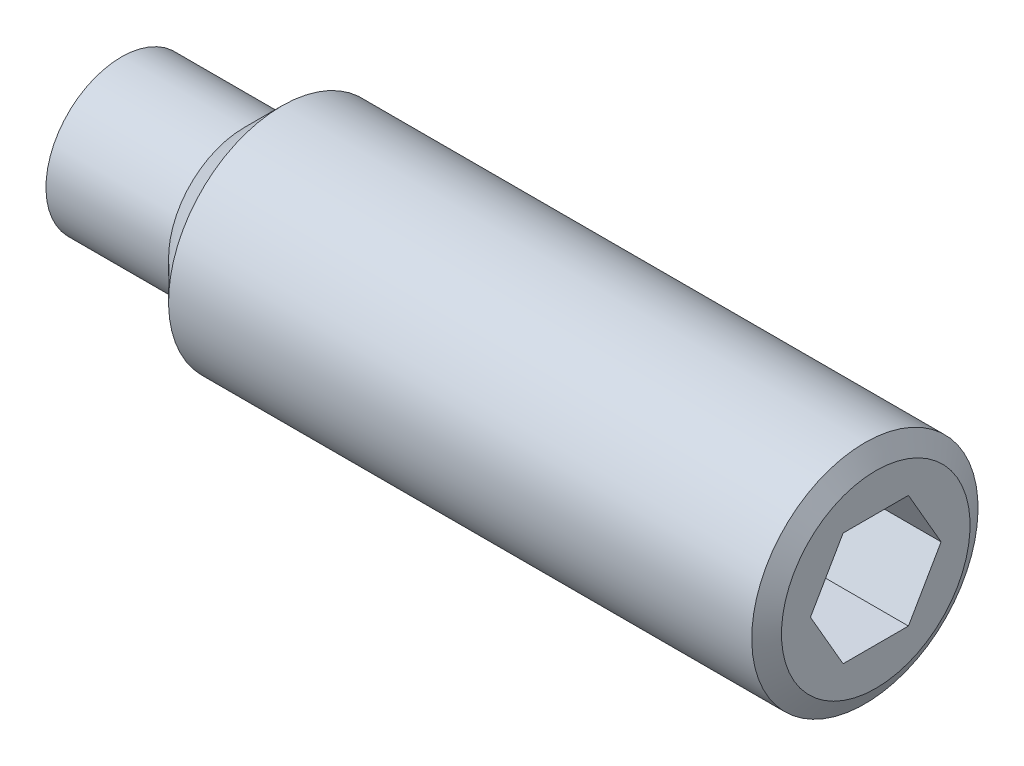
ISO-10303-21;
HEADER;
FILE_DESCRIPTION(('STEP AP214'),'2;1');
FILE_NAME('part.step','',(''),(''),'','','');
FILE_SCHEMA(('AUTOMOTIVE_DESIGN { 1 0 10303 214 1 1 1 1 }'));
ENDSEC;
DATA;
#1=APPLICATION_CONTEXT('core data for automotive mechanical design processes');
#2=APPLICATION_PROTOCOL_DEFINITION('international standard','automotive_design',2000,#1);
#3=PRODUCT_CONTEXT('',#1,'mechanical');
#4=PRODUCT('Part','Part','',(#3));
#5=PRODUCT_RELATED_PRODUCT_CATEGORY('part','',(#4));
#6=PRODUCT_DEFINITION_FORMATION('','',#4);
#7=PRODUCT_DEFINITION_CONTEXT('part definition',#1,'design');
#8=PRODUCT_DEFINITION('design','',#6,#7);
#9=PRODUCT_DEFINITION_SHAPE('','',#8);
#10=(LENGTH_UNIT() NAMED_UNIT(*) SI_UNIT(.MILLI.,.METRE.));
#11=(NAMED_UNIT(*) PLANE_ANGLE_UNIT() SI_UNIT($,.RADIAN.));
#12=(NAMED_UNIT(*) SI_UNIT($,.STERADIAN.) SOLID_ANGLE_UNIT());
#13=UNCERTAINTY_MEASURE_WITH_UNIT(LENGTH_MEASURE(1.E-05),#10,'distance_accuracy_value','');
#14=(GEOMETRIC_REPRESENTATION_CONTEXT(3) GLOBAL_UNCERTAINTY_ASSIGNED_CONTEXT((#13)) GLOBAL_UNIT_ASSIGNED_CONTEXT((#10,
#11,#12)) REPRESENTATION_CONTEXT('',''));
#15=CARTESIAN_POINT('',(0.,0.,0.));
#16=DIRECTION('',(0.,0.,1.));
#17=DIRECTION('',(1.,0.,0.));
#18=AXIS2_PLACEMENT_3D('',#15,#16,#17);
#19=CARTESIAN_POINT('',(0.,0.,0.));
#20=DIRECTION('',(1.,0.,0.));
#21=DIRECTION('',(0.,1.,0.));
#22=AXIS2_PLACEMENT_3D('',#19,#20,#21);
#23=PLANE('',#22);
#24=CARTESIAN_POINT('',(0.,0.,0.));
#25=DIRECTION('',(1.,0.,0.));
#26=DIRECTION('',(0.,1.,0.));
#27=AXIS2_PLACEMENT_3D('',#24,#25,#26);
#28=CIRCLE('',#27,2.49999999999999);
#29=CARTESIAN_POINT('',(0.,2.49999999999999,0.));
#30=VERTEX_POINT('',#29);
#31=EDGE_CURVE('E44',#30,#30,#28,.T.);
#32=ORIENTED_EDGE('',*,*,#31,.T.);
#33=EDGE_LOOP('',(#32));
#34=FACE_BOUND('',#33,.T.);
#35=DIRECTION('',(0.,0.866025403784439,-0.5));
#36=VECTOR('',#35,1.);
#37=CARTESIAN_POINT('',(0.,-1.5,-0.866025403784439));
#38=LINE('',#37,#36);
#39=CARTESIAN_POINT('',(0.,-1.5,-0.866025403784439));
#40=VERTEX_POINT('',#39);
#41=CARTESIAN_POINT('',(0.,0.,-1.73205080756888));
#42=VERTEX_POINT('',#41);
#43=EDGE_CURVE('E51',#40,#42,#38,.T.);
#44=ORIENTED_EDGE('',*,*,#43,.F.);
#45=DIRECTION('',(0.,0.,-1.));
#46=VECTOR('',#45,1.);
#47=CARTESIAN_POINT('',(0.,-1.5,0.866025403784438));
#48=LINE('',#47,#46);
#49=CARTESIAN_POINT('',(0.,-1.5,0.866025403784438));
#50=VERTEX_POINT('',#49);
#51=EDGE_CURVE('E134',#50,#40,#48,.T.);
#52=ORIENTED_EDGE('',*,*,#51,.F.);
#53=DIRECTION('',(0.,-0.866025403784438,-0.5));
#54=VECTOR('',#53,1.);
#55=CARTESIAN_POINT('',(0.,0.,1.73205080756888));
#56=LINE('',#55,#54);
#57=CARTESIAN_POINT('',(0.,0.,1.73205080756888));
#58=VERTEX_POINT('',#57);
#59=EDGE_CURVE('E132',#58,#50,#56,.T.);
#60=ORIENTED_EDGE('',*,*,#59,.F.);
#61=DIRECTION('',(0.,-0.866025403784439,0.5));
#62=VECTOR('',#61,1.);
#63=CARTESIAN_POINT('',(0.,1.5,0.866025403784438));
#64=LINE('',#63,#62);
#65=CARTESIAN_POINT('',(0.,1.5,0.866025403784438));
#66=VERTEX_POINT('',#65);
#67=EDGE_CURVE('E99',#66,#58,#64,.T.);
#68=ORIENTED_EDGE('',*,*,#67,.F.);
#69=DIRECTION('',(0.,0.,1.));
#70=VECTOR('',#69,1.);
#71=CARTESIAN_POINT('',(0.,1.5,-0.866025403784438));
#72=LINE('',#71,#70);
#73=CARTESIAN_POINT('',(0.,1.5,-0.866025403784438));
#74=VERTEX_POINT('',#73);
#75=EDGE_CURVE('E128',#74,#66,#72,.T.);
#76=ORIENTED_EDGE('',*,*,#75,.F.);
#77=DIRECTION('',(0.,0.866025403784438,0.5));
#78=VECTOR('',#77,1.);
#79=CARTESIAN_POINT('',(0.,0.,-1.73205080756888));
#80=LINE('',#79,#78);
#81=EDGE_CURVE('E125',#42,#74,#80,.T.);
#82=ORIENTED_EDGE('',*,*,#81,.F.);
#83=EDGE_LOOP('',(#44,#52,#60,#68,#76,#82));
#84=FACE_BOUND('',#83,.T.);
#85=ADVANCED_FACE('F36',(#34,#84),#23,.T.);
#86=CARTESIAN_POINT('',(0.,0.,0.));
#87=DIRECTION('',(1.,0.,0.));
#88=DIRECTION('',(0.,1.,0.));
#89=AXIS2_PLACEMENT_3D('',#86,#87,#88);
#90=CYLINDRICAL_SURFACE('',#89,3.);
#91=CARTESIAN_POINT('',(-0.288675134594819,0.,0.));
#92=DIRECTION('',(1.,0.,0.));
#93=DIRECTION('',(0.,1.,0.));
#94=AXIS2_PLACEMENT_3D('',#91,#92,#93);
#95=CIRCLE('',#94,3.);
#96=CARTESIAN_POINT('',(-0.28867513459482,3.,0.));
#97=VERTEX_POINT('',#96);
#98=EDGE_CURVE('E11',#97,#97,#95,.F.);
#99=ORIENTED_EDGE('',*,*,#98,.T.);
#100=EDGE_LOOP('',(#99));
#101=FACE_BOUND('',#100,.T.);
#102=CARTESIAN_POINT('',(-15.75,0.,0.));
#103=DIRECTION('',(1.,0.,0.));
#104=DIRECTION('',(0.,1.,0.));
#105=AXIS2_PLACEMENT_3D('',#102,#103,#104);
#106=CIRCLE('',#105,3.);
#107=CARTESIAN_POINT('',(-15.75,3.,0.));
#108=VERTEX_POINT('',#107);
#109=EDGE_CURVE('E149',#108,#108,#106,.T.);
#110=ORIENTED_EDGE('',*,*,#109,.T.);
#111=EDGE_LOOP('',(#110));
#112=FACE_BOUND('',#111,.T.);
#113=ADVANCED_FACE('F165',(#101,#112),#90,.T.);
#114=CARTESIAN_POINT('',(-15.75,0.,0.));
#115=DIRECTION('',(1.,0.,0.));
#116=DIRECTION('',(0.,1.,0.));
#117=AXIS2_PLACEMENT_3D('',#114,#115,#116);
#118=CONICAL_SURFACE('',#117,3.,0.78539816339745);
#119=CARTESIAN_POINT('',(-16.75,0.,0.));
#120=DIRECTION('',(1.,0.,0.));
#121=DIRECTION('',(0.,1.,0.));
#122=AXIS2_PLACEMENT_3D('',#119,#120,#121);
#123=CIRCLE('',#122,2.);
#124=CARTESIAN_POINT('',(-16.75,2.,0.));
#125=VERTEX_POINT('',#124);
#126=EDGE_CURVE('E146',#125,#125,#123,.T.);
#127=ORIENTED_EDGE('',*,*,#126,.T.);
#128=EDGE_LOOP('',(#127));
#129=FACE_BOUND('',#128,.T.);
#130=ORIENTED_EDGE('',*,*,#109,.F.);
#131=EDGE_LOOP('',(#130));
#132=FACE_BOUND('',#131,.T.);
#133=ADVANCED_FACE('F169',(#129,#132),#118,.T.);
#134=CARTESIAN_POINT('',(0.,0.,0.));
#135=DIRECTION('',(1.,0.,0.));
#136=DIRECTION('',(0.,1.,0.));
#137=AXIS2_PLACEMENT_3D('',#134,#135,#136);
#138=CYLINDRICAL_SURFACE('',#137,2.);
#139=CARTESIAN_POINT('',(-20.,0.,0.));
#140=DIRECTION('',(1.,0.,0.));
#141=DIRECTION('',(0.,1.,0.));
#142=AXIS2_PLACEMENT_3D('',#139,#140,#141);
#143=CIRCLE('',#142,2.);
#144=CARTESIAN_POINT('',(-20.,2.,0.));
#145=VERTEX_POINT('',#144);
#146=EDGE_CURVE('E138',#145,#145,#143,.T.);
#147=ORIENTED_EDGE('',*,*,#146,.T.);
#148=EDGE_LOOP('',(#147));
#149=FACE_BOUND('',#148,.T.);
#150=ORIENTED_EDGE('',*,*,#126,.F.);
#151=EDGE_LOOP('',(#150));
#152=FACE_BOUND('',#151,.T.);
#153=ADVANCED_FACE('F175',(#149,#152),#138,.T.);
#154=CARTESIAN_POINT('',(-20.,2.,0.));
#155=DIRECTION('',(-1.,0.,0.));
#156=DIRECTION('',(0.,-1.,0.));
#157=AXIS2_PLACEMENT_3D('',#154,#155,#156);
#158=PLANE('',#157);
#159=ORIENTED_EDGE('',*,*,#146,.F.);
#160=EDGE_LOOP('',(#159));
#161=FACE_BOUND('',#160,.T.);
#162=ADVANCED_FACE('F179',(#161),#158,.T.);
#163=CARTESIAN_POINT('',(-3.5,-1.5,-0.866025403784439));
#164=DIRECTION('',(0.,-0.5,-0.866025403784439));
#165=DIRECTION('',(0.,0.866025403784439,-0.5));
#166=AXIS2_PLACEMENT_3D('',#163,#164,#165);
#167=PLANE('',#166);
#168=ORIENTED_EDGE('',*,*,#43,.T.);
#169=DIRECTION('',(1.,0.,0.));
#170=VECTOR('',#169,1.);
#171=CARTESIAN_POINT('',(-3.5,0.,-1.73205080756888));
#172=LINE('',#171,#170);
#173=CARTESIAN_POINT('',(-3.5,0.,-1.73205080756888));
#174=VERTEX_POINT('',#173);
#175=EDGE_CURVE('E81',#174,#42,#172,.T.);
#176=ORIENTED_EDGE('',*,*,#175,.F.);
#177=DIRECTION('',(0.,0.866025403784439,-0.5));
#178=VECTOR('',#177,1.);
#179=CARTESIAN_POINT('',(-3.5,-1.5,-0.866025403784439));
#180=LINE('',#179,#178);
#181=CARTESIAN_POINT('',(-3.5,-1.5,-0.866025403784439));
#182=VERTEX_POINT('',#181);
#183=EDGE_CURVE('E136',#182,#174,#180,.T.);
#184=ORIENTED_EDGE('',*,*,#183,.F.);
#185=DIRECTION('',(1.,0.,0.));
#186=VECTOR('',#185,1.);
#187=CARTESIAN_POINT('',(-3.5,-1.5,-0.866025403784439));
#188=LINE('',#187,#186);
#189=EDGE_CURVE('E59',#182,#40,#188,.T.);
#190=ORIENTED_EDGE('',*,*,#189,.T.);
#191=EDGE_LOOP('',(#168,#176,#184,#190));
#192=FACE_BOUND('',#191,.T.);
#193=ADVANCED_FACE('F183',(#192),#167,.F.);
#194=CARTESIAN_POINT('',(-3.5,-1.5,0.866025403784438));
#195=DIRECTION('',(0.,-1.,0.));
#196=DIRECTION('',(1.,0.,0.));
#197=AXIS2_PLACEMENT_3D('',#194,#195,#196);
#198=PLANE('',#197);
#199=ORIENTED_EDGE('',*,*,#51,.T.);
#200=ORIENTED_EDGE('',*,*,#189,.F.);
#201=DIRECTION('',(0.,0.,-1.));
#202=VECTOR('',#201,1.);
#203=CARTESIAN_POINT('',(-3.5,-1.5,0.866025403784438));
#204=LINE('',#203,#202);
#205=CARTESIAN_POINT('',(-3.5,-1.5,0.866025403784438));
#206=VERTEX_POINT('',#205);
#207=EDGE_CURVE('E111',#206,#182,#204,.T.);
#208=ORIENTED_EDGE('',*,*,#207,.F.);
#209=DIRECTION('',(1.,0.,0.));
#210=VECTOR('',#209,1.);
#211=CARTESIAN_POINT('',(-3.5,-1.5,0.866025403784438));
#212=LINE('',#211,#210);
#213=EDGE_CURVE('E103',#206,#50,#212,.T.);
#214=ORIENTED_EDGE('',*,*,#213,.T.);
#215=EDGE_LOOP('',(#199,#200,#208,#214));
#216=FACE_BOUND('',#215,.T.);
#217=ADVANCED_FACE('F187',(#216),#198,.F.);
#218=CARTESIAN_POINT('',(-3.5,0.,1.73205080756888));
#219=DIRECTION('',(0.,-0.5,0.866025403784438));
#220=DIRECTION('',(0.,-0.866025403784439,-0.5));
#221=AXIS2_PLACEMENT_3D('',#218,#219,#220);
#222=PLANE('',#221);
#223=ORIENTED_EDGE('',*,*,#59,.T.);
#224=ORIENTED_EDGE('',*,*,#213,.F.);
#225=DIRECTION('',(0.,-0.866025403784438,-0.5));
#226=VECTOR('',#225,1.);
#227=CARTESIAN_POINT('',(-3.5,0.,1.73205080756888));
#228=LINE('',#227,#226);
#229=CARTESIAN_POINT('',(-3.5,0.,1.73205080756888));
#230=VERTEX_POINT('',#229);
#231=EDGE_CURVE('E107',#230,#206,#228,.T.);
#232=ORIENTED_EDGE('',*,*,#231,.F.);
#233=DIRECTION('',(1.,0.,0.));
#234=VECTOR('',#233,1.);
#235=CARTESIAN_POINT('',(-3.5,0.,1.73205080756888));
#236=LINE('',#235,#234);
#237=EDGE_CURVE('E92',#230,#58,#236,.T.);
#238=ORIENTED_EDGE('',*,*,#237,.T.);
#239=EDGE_LOOP('',(#223,#224,#232,#238));
#240=FACE_BOUND('',#239,.T.);
#241=ADVANCED_FACE('F108',(#240),#222,.F.);
#242=CARTESIAN_POINT('',(-3.5,1.5,0.866025403784438));
#243=DIRECTION('',(0.,0.5,0.866025403784439));
#244=DIRECTION('',(0.,-0.866025403784439,0.5));
#245=AXIS2_PLACEMENT_3D('',#242,#243,#244);
#246=PLANE('',#245);
#247=ORIENTED_EDGE('',*,*,#67,.T.);
#248=ORIENTED_EDGE('',*,*,#237,.F.);
#249=DIRECTION('',(0.,-0.866025403784439,0.5));
#250=VECTOR('',#249,1.);
#251=CARTESIAN_POINT('',(-3.5,1.5,0.866025403784438));
#252=LINE('',#251,#250);
#253=CARTESIAN_POINT('',(-3.5,1.5,0.866025403784438));
#254=VERTEX_POINT('',#253);
#255=EDGE_CURVE('E96',#254,#230,#252,.T.);
#256=ORIENTED_EDGE('',*,*,#255,.F.);
#257=DIRECTION('',(1.,0.,0.));
#258=VECTOR('',#257,1.);
#259=CARTESIAN_POINT('',(-3.5,1.5,0.866025403784438));
#260=LINE('',#259,#258);
#261=EDGE_CURVE('E104',#254,#66,#260,.T.);
#262=ORIENTED_EDGE('',*,*,#261,.T.);
#263=EDGE_LOOP('',(#247,#248,#256,#262));
#264=FACE_BOUND('',#263,.T.);
#265=ADVANCED_FACE('F94',(#264),#246,.F.);
#266=CARTESIAN_POINT('',(-3.5,1.5,-0.866025403784438));
#267=DIRECTION('',(0.,1.,0.));
#268=DIRECTION('',(-1.,0.,0.));
#269=AXIS2_PLACEMENT_3D('',#266,#267,#268);
#270=PLANE('',#269);
#271=ORIENTED_EDGE('',*,*,#75,.T.);
#272=ORIENTED_EDGE('',*,*,#261,.F.);
#273=DIRECTION('',(0.,0.,1.));
#274=VECTOR('',#273,1.);
#275=CARTESIAN_POINT('',(-3.5,1.5,-0.866025403784438));
#276=LINE('',#275,#274);
#277=CARTESIAN_POINT('',(-3.5,1.5,-0.866025403784438));
#278=VERTEX_POINT('',#277);
#279=EDGE_CURVE('E117',#278,#254,#276,.T.);
#280=ORIENTED_EDGE('',*,*,#279,.F.);
#281=DIRECTION('',(1.,0.,0.));
#282=VECTOR('',#281,1.);
#283=CARTESIAN_POINT('',(-3.5,1.5,-0.866025403784438));
#284=LINE('',#283,#282);
#285=EDGE_CURVE('E141',#278,#74,#284,.T.);
#286=ORIENTED_EDGE('',*,*,#285,.T.);
#287=EDGE_LOOP('',(#271,#272,#280,#286));
#288=FACE_BOUND('',#287,.T.);
#289=ADVANCED_FACE('F190',(#288),#270,.F.);
#290=CARTESIAN_POINT('',(-3.5,0.,-1.73205080756888));
#291=DIRECTION('',(0.,0.5,-0.866025403784438));
#292=DIRECTION('',(0.,0.866025403784439,0.5));
#293=AXIS2_PLACEMENT_3D('',#290,#291,#292);
#294=PLANE('',#293);
#295=ORIENTED_EDGE('',*,*,#81,.T.);
#296=ORIENTED_EDGE('',*,*,#285,.F.);
#297=DIRECTION('',(0.,0.866025403784438,0.5));
#298=VECTOR('',#297,1.);
#299=CARTESIAN_POINT('',(-3.5,0.,-1.73205080756888));
#300=LINE('',#299,#298);
#301=EDGE_CURVE('E119',#174,#278,#300,.T.);
#302=ORIENTED_EDGE('',*,*,#301,.F.);
#303=ORIENTED_EDGE('',*,*,#175,.T.);
#304=EDGE_LOOP('',(#295,#296,#302,#303));
#305=FACE_BOUND('',#304,.T.);
#306=ADVANCED_FACE('F161',(#305),#294,.F.);
#307=CARTESIAN_POINT('',(-3.5,0.,-1.73205080756888));
#308=DIRECTION('',(1.,0.,0.));
#309=DIRECTION('',(0.,1.,0.));
#310=AXIS2_PLACEMENT_3D('',#307,#308,#309);
#311=PLANE('',#310);
#312=ORIENTED_EDGE('',*,*,#183,.T.);
#313=ORIENTED_EDGE('',*,*,#301,.T.);
#314=ORIENTED_EDGE('',*,*,#279,.T.);
#315=ORIENTED_EDGE('',*,*,#255,.T.);
#316=ORIENTED_EDGE('',*,*,#231,.T.);
#317=ORIENTED_EDGE('',*,*,#207,.T.);
#318=EDGE_LOOP('',(#312,#313,#314,#315,#316,#317));
#319=FACE_BOUND('',#318,.T.);
#320=ADVANCED_FACE('F114',(#319),#311,.T.);
#321=CARTESIAN_POINT('',(0.,0.,0.));
#322=DIRECTION('',(-1.,0.,0.));
#323=DIRECTION('',(0.,-1.,0.));
#324=AXIS2_PLACEMENT_3D('',#321,#322,#323);
#325=CONICAL_SURFACE('',#324,2.49999999999999,1.0471975511966);
#326=ORIENTED_EDGE('',*,*,#98,.F.);
#327=EDGE_LOOP('',(#326));
#328=FACE_BOUND('',#327,.T.);
#329=ORIENTED_EDGE('',*,*,#31,.F.);
#330=EDGE_LOOP('',(#329));
#331=FACE_BOUND('',#330,.T.);
#332=ADVANCED_FACE('F38',(#328,#331),#325,.T.);
#333=CLOSED_SHELL('',(#85,#113,#133,#153,#162,#193,#217,#241,#265,#289,#306,#320,#332));
#334=MANIFOLD_SOLID_BREP('B2',#333);
#335=ADVANCED_BREP_SHAPE_REPRESENTATION('',(#18,#334),#14);
#336=SHAPE_DEFINITION_REPRESENTATION(#9,#335);
ENDSEC;
END-ISO-10303-21;
